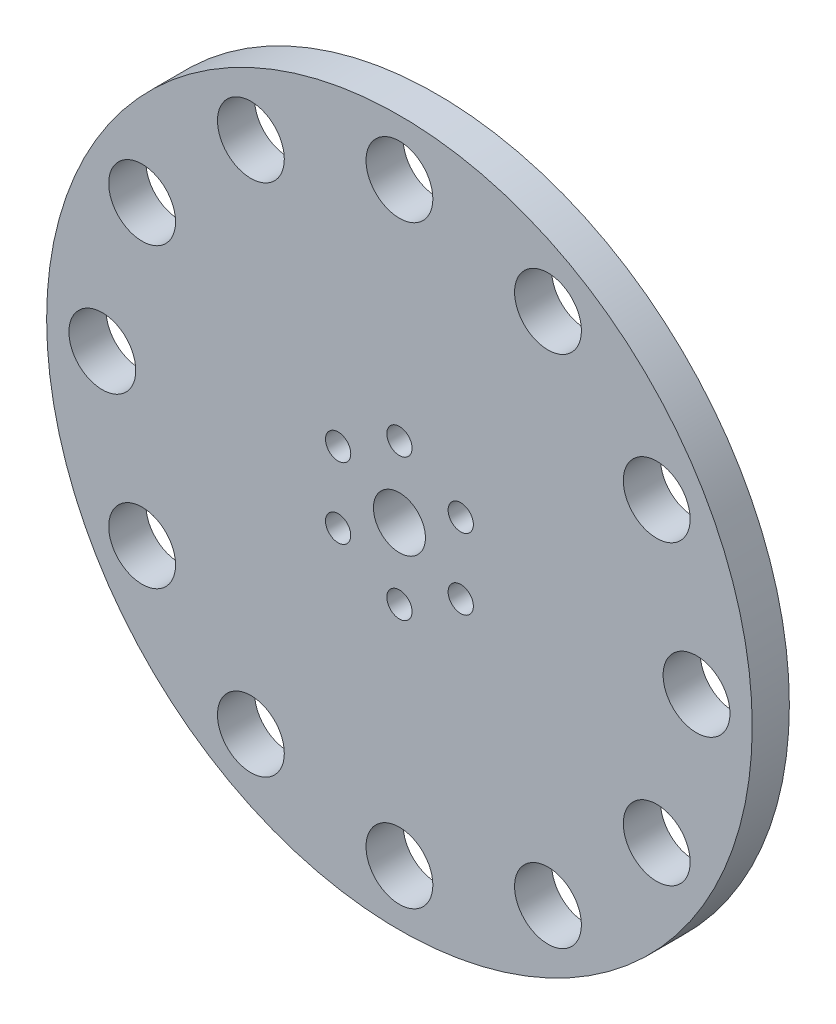
ISO-10303-21;
HEADER;
FILE_DESCRIPTION(('STEP AP214'),'2;1');
FILE_NAME('part.step','',(''),(''),'','','');
FILE_SCHEMA(('AUTOMOTIVE_DESIGN { 1 0 10303 214 1 1 1 1 }'));
ENDSEC;
DATA;
#1=APPLICATION_CONTEXT('core data for automotive mechanical design processes');
#2=APPLICATION_PROTOCOL_DEFINITION('international standard','automotive_design',2000,#1);
#3=PRODUCT_CONTEXT('',#1,'mechanical');
#4=PRODUCT('Part','Part','',(#3));
#5=PRODUCT_RELATED_PRODUCT_CATEGORY('part','',(#4));
#6=PRODUCT_DEFINITION_FORMATION('','',#4);
#7=PRODUCT_DEFINITION_CONTEXT('part definition',#1,'design');
#8=PRODUCT_DEFINITION('design','',#6,#7);
#9=PRODUCT_DEFINITION_SHAPE('','',#8);
#10=(LENGTH_UNIT() NAMED_UNIT(*) SI_UNIT(.MILLI.,.METRE.));
#11=(NAMED_UNIT(*) PLANE_ANGLE_UNIT() SI_UNIT($,.RADIAN.));
#12=(NAMED_UNIT(*) SI_UNIT($,.STERADIAN.) SOLID_ANGLE_UNIT());
#13=UNCERTAINTY_MEASURE_WITH_UNIT(LENGTH_MEASURE(1.E-05),#10,'distance_accuracy_value','');
#14=(GEOMETRIC_REPRESENTATION_CONTEXT(3) GLOBAL_UNCERTAINTY_ASSIGNED_CONTEXT((#13)) GLOBAL_UNIT_ASSIGNED_CONTEXT((#10,
#11,#12)) REPRESENTATION_CONTEXT('',''));
#15=CARTESIAN_POINT('',(0.,0.,0.));
#16=DIRECTION('',(0.,0.,1.));
#17=DIRECTION('',(1.,0.,0.));
#18=AXIS2_PLACEMENT_3D('',#15,#16,#17);
#19=CARTESIAN_POINT('',(0.,0.,5.));
#20=DIRECTION('',(0.,0.,1.));
#21=DIRECTION('',(1.,0.,0.));
#22=AXIS2_PLACEMENT_3D('',#19,#20,#21);
#23=PLANE('',#22);
#24=CARTESIAN_POINT('',(-39.9999999999965,-3.48043475842534E-12,5.));
#25=DIRECTION('',(0.,0.,1.));
#26=DIRECTION('',(1.,0.,0.));
#27=AXIS2_PLACEMENT_3D('',#24,#25,#26);
#28=CIRCLE('',#27,4.5);
#29=CARTESIAN_POINT('',(-35.4999999999965,-3.48043475842534E-12,5.));
#30=VERTEX_POINT('',#29);
#31=EDGE_CURVE('E108',#30,#30,#28,.T.);
#32=ORIENTED_EDGE('',*,*,#31,.F.);
#33=EDGE_LOOP('',(#32));
#34=FACE_BOUND('',#33,.T.);
#35=CARTESIAN_POINT('',(-34.6410161513723,-20.000000000003,5.));
#36=DIRECTION('',(0.,0.,1.));
#37=DIRECTION('',(1.,0.,0.));
#38=AXIS2_PLACEMENT_3D('',#35,#36,#37);
#39=CIRCLE('',#38,4.5);
#40=CARTESIAN_POINT('',(-30.1410161513723,-20.000000000003,5.));
#41=VERTEX_POINT('',#40);
#42=EDGE_CURVE('E115',#41,#41,#39,.T.);
#43=ORIENTED_EDGE('',*,*,#42,.F.);
#44=EDGE_LOOP('',(#43));
#45=FACE_BOUND('',#44,.T.);
#46=CARTESIAN_POINT('',(-19.9999999999935,-34.6410161513793,5.));
#47=DIRECTION('',(0.,0.,1.));
#48=DIRECTION('',(1.,0.,0.));
#49=AXIS2_PLACEMENT_3D('',#46,#47,#48);
#50=CIRCLE('',#49,4.5);
#51=CARTESIAN_POINT('',(-15.4999999999935,-34.6410161513793,5.));
#52=VERTEX_POINT('',#51);
#53=EDGE_CURVE('E121',#52,#52,#50,.T.);
#54=ORIENTED_EDGE('',*,*,#53,.F.);
#55=EDGE_LOOP('',(#54));
#56=FACE_BOUND('',#55,.T.);
#57=CARTESIAN_POINT('',(6.95107234245751E-12,-40.,5.));
#58=DIRECTION('',(0.,0.,1.));
#59=DIRECTION('',(1.,0.,0.));
#60=AXIS2_PLACEMENT_3D('',#57,#58,#59);
#61=CIRCLE('',#60,4.5);
#62=CARTESIAN_POINT('',(4.50000000000695,-40.,5.));
#63=VERTEX_POINT('',#62);
#64=EDGE_CURVE('E127',#63,#63,#61,.T.);
#65=ORIENTED_EDGE('',*,*,#64,.F.);
#66=EDGE_LOOP('',(#65));
#67=FACE_BOUND('',#66,.T.);
#68=CARTESIAN_POINT('',(20.0000000000065,-34.6410161513758,5.));
#69=DIRECTION('',(0.,0.,1.));
#70=DIRECTION('',(1.,0.,0.));
#71=AXIS2_PLACEMENT_3D('',#68,#69,#70);
#72=CIRCLE('',#71,4.5);
#73=CARTESIAN_POINT('',(24.5000000000065,-34.6410161513758,5.));
#74=VERTEX_POINT('',#73);
#75=EDGE_CURVE('E133',#74,#74,#72,.T.);
#76=ORIENTED_EDGE('',*,*,#75,.F.);
#77=EDGE_LOOP('',(#76));
#78=FACE_BOUND('',#77,.T.);
#79=CARTESIAN_POINT('',(34.6410161513828,-19.999999999997,5.));
#80=DIRECTION('',(0.,0.,1.));
#81=DIRECTION('',(1.,0.,0.));
#82=AXIS2_PLACEMENT_3D('',#79,#80,#81);
#83=CIRCLE('',#82,4.50000000000008);
#84=CARTESIAN_POINT('',(39.1410161513828,-19.999999999997,5.));
#85=VERTEX_POINT('',#84);
#86=EDGE_CURVE('E139',#85,#85,#83,.T.);
#87=ORIENTED_EDGE('',*,*,#86,.F.);
#88=EDGE_LOOP('',(#87));
#89=FACE_BOUND('',#88,.T.);
#90=CARTESIAN_POINT('',(40.0000000000035,3.47553617122876E-12,5.));
#91=DIRECTION('',(0.,0.,1.));
#92=DIRECTION('',(1.,0.,0.));
#93=AXIS2_PLACEMENT_3D('',#90,#91,#92);
#94=CIRCLE('',#93,4.5);
#95=CARTESIAN_POINT('',(44.5000000000035,3.47553617122876E-12,5.));
#96=VERTEX_POINT('',#95);
#97=EDGE_CURVE('E145',#96,#96,#94,.T.);
#98=ORIENTED_EDGE('',*,*,#97,.F.);
#99=EDGE_LOOP('',(#98));
#100=FACE_BOUND('',#99,.T.);
#101=CARTESIAN_POINT('',(34.6410161513793,20.000000000003,5.));
#102=DIRECTION('',(0.,0.,1.));
#103=DIRECTION('',(1.,0.,0.));
#104=AXIS2_PLACEMENT_3D('',#101,#102,#103);
#105=CIRCLE('',#104,4.5);
#106=CARTESIAN_POINT('',(39.1410161513793,20.000000000003,5.));
#107=VERTEX_POINT('',#106);
#108=EDGE_CURVE('E151',#107,#107,#105,.T.);
#109=ORIENTED_EDGE('',*,*,#108,.F.);
#110=EDGE_LOOP('',(#109));
#111=FACE_BOUND('',#110,.T.);
#112=CARTESIAN_POINT('',(0.,40.,5.));
#113=DIRECTION('',(0.,0.,1.));
#114=DIRECTION('',(1.,0.,0.));
#115=AXIS2_PLACEMENT_3D('',#112,#113,#114);
#116=CIRCLE('',#115,4.5);
#117=CARTESIAN_POINT('',(4.5,40.,5.));
#118=VERTEX_POINT('',#117);
#119=EDGE_CURVE('E79',#118,#118,#116,.T.);
#120=ORIENTED_EDGE('',*,*,#119,.F.);
#121=EDGE_LOOP('',(#120));
#122=FACE_BOUND('',#121,.T.);
#123=CARTESIAN_POINT('',(-34.6410161513758,19.999999999997,5.));
#124=DIRECTION('',(0.,0.,1.));
#125=DIRECTION('',(1.,0.,0.));
#126=AXIS2_PLACEMENT_3D('',#123,#124,#125);
#127=CIRCLE('',#126,4.5);
#128=CARTESIAN_POINT('',(-30.1410161513758,19.999999999997,5.));
#129=VERTEX_POINT('',#128);
#130=EDGE_CURVE('E73',#129,#129,#127,.T.);
#131=ORIENTED_EDGE('',*,*,#130,.F.);
#132=EDGE_LOOP('',(#131));
#133=FACE_BOUND('',#132,.T.);
#134=CARTESIAN_POINT('',(8.25322209806571,4.76499999999998,5.));
#135=DIRECTION('',(0.,0.,1.));
#136=DIRECTION('',(1.,0.,0.));
#137=AXIS2_PLACEMENT_3D('',#134,#135,#136);
#138=CIRCLE('',#137,1.7);
#139=CARTESIAN_POINT('',(9.95322209806571,4.76499999999998,5.));
#140=VERTEX_POINT('',#139);
#141=EDGE_CURVE('E67',#140,#140,#138,.T.);
#142=ORIENTED_EDGE('',*,*,#141,.F.);
#143=EDGE_LOOP('',(#142));
#144=FACE_BOUND('',#143,.T.);
#145=CARTESIAN_POINT('',(8.25322209806651,-4.76499999999953,5.));
#146=DIRECTION('',(0.,0.,1.));
#147=DIRECTION('',(1.,0.,0.));
#148=AXIS2_PLACEMENT_3D('',#145,#146,#147);
#149=CIRCLE('',#148,1.70000000000068);
#150=CARTESIAN_POINT('',(9.95322209806719,-4.76499999999953,5.));
#151=VERTEX_POINT('',#150);
#152=EDGE_CURVE('E60',#151,#151,#149,.T.);
#153=ORIENTED_EDGE('',*,*,#152,.F.);
#154=EDGE_LOOP('',(#153));
#155=FACE_BOUND('',#154,.T.);
#156=CARTESIAN_POINT('',(1.07993429828824E-12,-9.53,5.));
#157=DIRECTION('',(0.,0.,1.));
#158=DIRECTION('',(1.,0.,0.));
#159=AXIS2_PLACEMENT_3D('',#156,#157,#158);
#160=CIRCLE('',#159,1.7000000000011);
#161=CARTESIAN_POINT('',(1.70000000000218,-9.53,5.));
#162=VERTEX_POINT('',#161);
#163=EDGE_CURVE('E103',#162,#162,#160,.T.);
#164=ORIENTED_EDGE('',*,*,#163,.F.);
#165=EDGE_LOOP('',(#164));
#166=FACE_BOUND('',#165,.T.);
#167=CARTESIAN_POINT('',(-8.25322209806489,-4.76500000000047,5.));
#168=DIRECTION('',(0.,0.,1.));
#169=DIRECTION('',(1.,0.,0.));
#170=AXIS2_PLACEMENT_3D('',#167,#168,#169);
#171=CIRCLE('',#170,1.700000000001);
#172=CARTESIAN_POINT('',(-6.55322209806389,-4.76500000000047,5.));
#173=VERTEX_POINT('',#172);
#174=EDGE_CURVE('E97',#173,#173,#171,.T.);
#175=ORIENTED_EDGE('',*,*,#174,.F.);
#176=EDGE_LOOP('',(#175));
#177=FACE_BOUND('',#176,.T.);
#178=CARTESIAN_POINT('',(-8.25322209806564,4.7650000000001,5.));
#179=DIRECTION('',(0.,0.,1.));
#180=DIRECTION('',(1.,0.,0.));
#181=AXIS2_PLACEMENT_3D('',#178,#179,#180);
#182=CIRCLE('',#181,1.7);
#183=CARTESIAN_POINT('',(-6.55322209806564,4.7650000000001,5.));
#184=VERTEX_POINT('',#183);
#185=EDGE_CURVE('E91',#184,#184,#182,.T.);
#186=ORIENTED_EDGE('',*,*,#185,.F.);
#187=EDGE_LOOP('',(#186));
#188=FACE_BOUND('',#187,.T.);
#189=CARTESIAN_POINT('',(20.0000000000005,34.6410161513793,5.));
#190=DIRECTION('',(0.,0.,1.));
#191=DIRECTION('',(1.,0.,0.));
#192=AXIS2_PLACEMENT_3D('',#189,#190,#191);
#193=CIRCLE('',#192,4.50000000000001);
#194=CARTESIAN_POINT('',(24.5000000000005,34.6410161513793,5.));
#195=VERTEX_POINT('',#194);
#196=EDGE_CURVE('E84',#195,#195,#193,.T.);
#197=ORIENTED_EDGE('',*,*,#196,.F.);
#198=EDGE_LOOP('',(#197));
#199=FACE_BOUND('',#198,.T.);
#200=CARTESIAN_POINT('',(-19.9999999999996,34.6410161513758,5.));
#201=DIRECTION('',(0.,0.,1.));
#202=DIRECTION('',(1.,0.,0.));
#203=AXIS2_PLACEMENT_3D('',#200,#201,#202);
#204=CIRCLE('',#203,4.50000000000001);
#205=CARTESIAN_POINT('',(-15.4999999999995,34.6410161513758,5.));
#206=VERTEX_POINT('',#205);
#207=EDGE_CURVE('E156',#206,#206,#204,.T.);
#208=ORIENTED_EDGE('',*,*,#207,.F.);
#209=EDGE_LOOP('',(#208));
#210=FACE_BOUND('',#209,.T.);
#211=CARTESIAN_POINT('',(0.,9.53,5.));
#212=DIRECTION('',(0.,0.,1.));
#213=DIRECTION('',(1.,0.,0.));
#214=AXIS2_PLACEMENT_3D('',#211,#212,#213);
#215=CIRCLE('',#214,1.7);
#216=CARTESIAN_POINT('',(1.7,9.53,5.));
#217=VERTEX_POINT('',#216);
#218=EDGE_CURVE('E54',#217,#217,#215,.T.);
#219=ORIENTED_EDGE('',*,*,#218,.F.);
#220=EDGE_LOOP('',(#219));
#221=FACE_BOUND('',#220,.T.);
#222=CARTESIAN_POINT('',(0.,0.,5.));
#223=DIRECTION('',(0.,0.,1.));
#224=DIRECTION('',(1.,0.,0.));
#225=AXIS2_PLACEMENT_3D('',#222,#223,#224);
#226=CIRCLE('',#225,47.5);
#227=CARTESIAN_POINT('',(47.5,0.,5.));
#228=VERTEX_POINT('',#227);
#229=EDGE_CURVE('E10',#228,#228,#226,.T.);
#230=ORIENTED_EDGE('',*,*,#229,.T.);
#231=EDGE_LOOP('',(#230));
#232=FACE_BOUND('',#231,.T.);
#233=CARTESIAN_POINT('',(0.,0.,5.));
#234=DIRECTION('',(0.,0.,1.));
#235=DIRECTION('',(1.,0.,0.));
#236=AXIS2_PLACEMENT_3D('',#233,#234,#235);
#237=CIRCLE('',#236,3.5);
#238=CARTESIAN_POINT('',(3.5,0.,5.));
#239=VERTEX_POINT('',#238);
#240=EDGE_CURVE('E46',#239,#239,#237,.T.);
#241=ORIENTED_EDGE('',*,*,#240,.F.);
#242=EDGE_LOOP('',(#241));
#243=FACE_BOUND('',#242,.T.);
#244=ADVANCED_FACE('F35',(#34,#45,#56,#67,#78,#89,#100,#111,#122,#133,#144,#155,#166,#177,#188,
#199,#210,#221,#232,#243),#23,.T.);
#245=CARTESIAN_POINT('',(0.,0.,0.));
#246=DIRECTION('',(0.,0.,1.));
#247=DIRECTION('',(1.,0.,0.));
#248=AXIS2_PLACEMENT_3D('',#245,#246,#247);
#249=PLANE('',#248);
#250=CARTESIAN_POINT('',(-39.9999999999965,-3.48043475842534E-12,0.));
#251=DIRECTION('',(0.,0.,1.));
#252=DIRECTION('',(1.,0.,0.));
#253=AXIS2_PLACEMENT_3D('',#250,#251,#252);
#254=CIRCLE('',#253,4.5);
#255=CARTESIAN_POINT('',(-35.4999999999965,-3.48043475842534E-12,0.));
#256=VERTEX_POINT('',#255);
#257=EDGE_CURVE('E111',#256,#256,#254,.T.);
#258=ORIENTED_EDGE('',*,*,#257,.T.);
#259=EDGE_LOOP('',(#258));
#260=FACE_BOUND('',#259,.T.);
#261=CARTESIAN_POINT('',(-34.6410161513723,-20.000000000003,0.));
#262=DIRECTION('',(0.,0.,1.));
#263=DIRECTION('',(1.,0.,0.));
#264=AXIS2_PLACEMENT_3D('',#261,#262,#263);
#265=CIRCLE('',#264,4.5);
#266=CARTESIAN_POINT('',(-30.1410161513723,-20.000000000003,0.));
#267=VERTEX_POINT('',#266);
#268=EDGE_CURVE('E118',#267,#267,#265,.T.);
#269=ORIENTED_EDGE('',*,*,#268,.T.);
#270=EDGE_LOOP('',(#269));
#271=FACE_BOUND('',#270,.T.);
#272=CARTESIAN_POINT('',(-19.9999999999935,-34.6410161513793,0.));
#273=DIRECTION('',(0.,0.,1.));
#274=DIRECTION('',(1.,0.,0.));
#275=AXIS2_PLACEMENT_3D('',#272,#273,#274);
#276=CIRCLE('',#275,4.5);
#277=CARTESIAN_POINT('',(-15.4999999999935,-34.6410161513793,0.));
#278=VERTEX_POINT('',#277);
#279=EDGE_CURVE('E124',#278,#278,#276,.T.);
#280=ORIENTED_EDGE('',*,*,#279,.T.);
#281=EDGE_LOOP('',(#280));
#282=FACE_BOUND('',#281,.T.);
#283=CARTESIAN_POINT('',(6.95107234245751E-12,-40.,0.));
#284=DIRECTION('',(0.,0.,1.));
#285=DIRECTION('',(1.,0.,0.));
#286=AXIS2_PLACEMENT_3D('',#283,#284,#285);
#287=CIRCLE('',#286,4.5);
#288=CARTESIAN_POINT('',(4.50000000000695,-40.,0.));
#289=VERTEX_POINT('',#288);
#290=EDGE_CURVE('E130',#289,#289,#287,.T.);
#291=ORIENTED_EDGE('',*,*,#290,.T.);
#292=EDGE_LOOP('',(#291));
#293=FACE_BOUND('',#292,.T.);
#294=CARTESIAN_POINT('',(20.0000000000065,-34.6410161513758,0.));
#295=DIRECTION('',(0.,0.,1.));
#296=DIRECTION('',(1.,0.,0.));
#297=AXIS2_PLACEMENT_3D('',#294,#295,#296);
#298=CIRCLE('',#297,4.5);
#299=CARTESIAN_POINT('',(24.5000000000065,-34.6410161513758,0.));
#300=VERTEX_POINT('',#299);
#301=EDGE_CURVE('E136',#300,#300,#298,.T.);
#302=ORIENTED_EDGE('',*,*,#301,.T.);
#303=EDGE_LOOP('',(#302));
#304=FACE_BOUND('',#303,.T.);
#305=CARTESIAN_POINT('',(34.6410161513828,-19.999999999997,0.));
#306=DIRECTION('',(0.,0.,1.));
#307=DIRECTION('',(1.,0.,0.));
#308=AXIS2_PLACEMENT_3D('',#305,#306,#307);
#309=CIRCLE('',#308,4.50000000000008);
#310=CARTESIAN_POINT('',(39.1410161513828,-19.999999999997,0.));
#311=VERTEX_POINT('',#310);
#312=EDGE_CURVE('E142',#311,#311,#309,.T.);
#313=ORIENTED_EDGE('',*,*,#312,.T.);
#314=EDGE_LOOP('',(#313));
#315=FACE_BOUND('',#314,.T.);
#316=CARTESIAN_POINT('',(40.0000000000035,3.47553617122876E-12,0.));
#317=DIRECTION('',(0.,0.,1.));
#318=DIRECTION('',(1.,0.,0.));
#319=AXIS2_PLACEMENT_3D('',#316,#317,#318);
#320=CIRCLE('',#319,4.5);
#321=CARTESIAN_POINT('',(44.5000000000035,3.47553617122876E-12,0.));
#322=VERTEX_POINT('',#321);
#323=EDGE_CURVE('E148',#322,#322,#320,.T.);
#324=ORIENTED_EDGE('',*,*,#323,.T.);
#325=EDGE_LOOP('',(#324));
#326=FACE_BOUND('',#325,.T.);
#327=CARTESIAN_POINT('',(34.6410161513793,20.000000000003,0.));
#328=DIRECTION('',(0.,0.,1.));
#329=DIRECTION('',(1.,0.,0.));
#330=AXIS2_PLACEMENT_3D('',#327,#328,#329);
#331=CIRCLE('',#330,4.5);
#332=CARTESIAN_POINT('',(39.1410161513793,20.000000000003,0.));
#333=VERTEX_POINT('',#332);
#334=EDGE_CURVE('E88',#333,#333,#331,.T.);
#335=ORIENTED_EDGE('',*,*,#334,.T.);
#336=EDGE_LOOP('',(#335));
#337=FACE_BOUND('',#336,.T.);
#338=CARTESIAN_POINT('',(0.,40.,0.));
#339=DIRECTION('',(0.,0.,1.));
#340=DIRECTION('',(1.,0.,0.));
#341=AXIS2_PLACEMENT_3D('',#338,#339,#340);
#342=CIRCLE('',#341,4.5);
#343=CARTESIAN_POINT('',(4.5,40.,0.));
#344=VERTEX_POINT('',#343);
#345=EDGE_CURVE('E57',#344,#344,#342,.T.);
#346=ORIENTED_EDGE('',*,*,#345,.T.);
#347=EDGE_LOOP('',(#346));
#348=FACE_BOUND('',#347,.T.);
#349=CARTESIAN_POINT('',(-34.6410161513758,19.999999999997,0.));
#350=DIRECTION('',(0.,0.,1.));
#351=DIRECTION('',(1.,0.,0.));
#352=AXIS2_PLACEMENT_3D('',#349,#350,#351);
#353=CIRCLE('',#352,4.5);
#354=CARTESIAN_POINT('',(-30.1410161513758,19.999999999997,0.));
#355=VERTEX_POINT('',#354);
#356=EDGE_CURVE('E76',#355,#355,#353,.T.);
#357=ORIENTED_EDGE('',*,*,#356,.T.);
#358=EDGE_LOOP('',(#357));
#359=FACE_BOUND('',#358,.T.);
#360=CARTESIAN_POINT('',(8.25322209806571,4.76499999999998,0.));
#361=DIRECTION('',(0.,0.,1.));
#362=DIRECTION('',(1.,0.,0.));
#363=AXIS2_PLACEMENT_3D('',#360,#361,#362);
#364=CIRCLE('',#363,1.7);
#365=CARTESIAN_POINT('',(9.95322209806571,4.76499999999998,0.));
#366=VERTEX_POINT('',#365);
#367=EDGE_CURVE('E70',#366,#366,#364,.T.);
#368=ORIENTED_EDGE('',*,*,#367,.T.);
#369=EDGE_LOOP('',(#368));
#370=FACE_BOUND('',#369,.T.);
#371=CARTESIAN_POINT('',(8.25322209806651,-4.76499999999953,0.));
#372=DIRECTION('',(0.,0.,1.));
#373=DIRECTION('',(1.,0.,0.));
#374=AXIS2_PLACEMENT_3D('',#371,#372,#373);
#375=CIRCLE('',#374,1.70000000000068);
#376=CARTESIAN_POINT('',(9.95322209806719,-4.76499999999953,0.));
#377=VERTEX_POINT('',#376);
#378=EDGE_CURVE('E63',#377,#377,#375,.T.);
#379=ORIENTED_EDGE('',*,*,#378,.T.);
#380=EDGE_LOOP('',(#379));
#381=FACE_BOUND('',#380,.T.);
#382=CARTESIAN_POINT('',(1.07993429828824E-12,-9.53,0.));
#383=DIRECTION('',(0.,0.,1.));
#384=DIRECTION('',(1.,0.,0.));
#385=AXIS2_PLACEMENT_3D('',#382,#383,#384);
#386=CIRCLE('',#385,1.7000000000011);
#387=CARTESIAN_POINT('',(1.70000000000218,-9.53,0.));
#388=VERTEX_POINT('',#387);
#389=EDGE_CURVE('E64',#388,#388,#386,.T.);
#390=ORIENTED_EDGE('',*,*,#389,.T.);
#391=EDGE_LOOP('',(#390));
#392=FACE_BOUND('',#391,.T.);
#393=CARTESIAN_POINT('',(-8.25322209806489,-4.76500000000047,0.));
#394=DIRECTION('',(0.,0.,1.));
#395=DIRECTION('',(1.,0.,0.));
#396=AXIS2_PLACEMENT_3D('',#393,#394,#395);
#397=CIRCLE('',#396,1.700000000001);
#398=CARTESIAN_POINT('',(-6.55322209806389,-4.76500000000047,0.));
#399=VERTEX_POINT('',#398);
#400=EDGE_CURVE('E100',#399,#399,#397,.T.);
#401=ORIENTED_EDGE('',*,*,#400,.T.);
#402=EDGE_LOOP('',(#401));
#403=FACE_BOUND('',#402,.T.);
#404=CARTESIAN_POINT('',(-8.25322209806564,4.7650000000001,0.));
#405=DIRECTION('',(0.,0.,1.));
#406=DIRECTION('',(1.,0.,0.));
#407=AXIS2_PLACEMENT_3D('',#404,#405,#406);
#408=CIRCLE('',#407,1.7);
#409=CARTESIAN_POINT('',(-6.55322209806564,4.7650000000001,0.));
#410=VERTEX_POINT('',#409);
#411=EDGE_CURVE('E94',#410,#410,#408,.T.);
#412=ORIENTED_EDGE('',*,*,#411,.T.);
#413=EDGE_LOOP('',(#412));
#414=FACE_BOUND('',#413,.T.);
#415=CARTESIAN_POINT('',(20.0000000000005,34.6410161513793,0.));
#416=DIRECTION('',(0.,0.,1.));
#417=DIRECTION('',(1.,0.,0.));
#418=AXIS2_PLACEMENT_3D('',#415,#416,#417);
#419=CIRCLE('',#418,4.50000000000001);
#420=CARTESIAN_POINT('',(24.5000000000005,34.6410161513793,0.));
#421=VERTEX_POINT('',#420);
#422=EDGE_CURVE('E87',#421,#421,#419,.T.);
#423=ORIENTED_EDGE('',*,*,#422,.T.);
#424=EDGE_LOOP('',(#423));
#425=FACE_BOUND('',#424,.T.);
#426=CARTESIAN_POINT('',(-19.9999999999996,34.6410161513758,0.));
#427=DIRECTION('',(0.,0.,1.));
#428=DIRECTION('',(1.,0.,0.));
#429=AXIS2_PLACEMENT_3D('',#426,#427,#428);
#430=CIRCLE('',#429,4.50000000000001);
#431=CARTESIAN_POINT('',(-15.4999999999995,34.6410161513758,0.));
#432=VERTEX_POINT('',#431);
#433=EDGE_CURVE('E112',#432,#432,#430,.T.);
#434=ORIENTED_EDGE('',*,*,#433,.T.);
#435=EDGE_LOOP('',(#434));
#436=FACE_BOUND('',#435,.T.);
#437=CARTESIAN_POINT('',(0.,9.53,0.));
#438=DIRECTION('',(0.,0.,1.));
#439=DIRECTION('',(1.,0.,0.));
#440=AXIS2_PLACEMENT_3D('',#437,#438,#439);
#441=CIRCLE('',#440,1.7);
#442=CARTESIAN_POINT('',(1.7,9.53,0.));
#443=VERTEX_POINT('',#442);
#444=EDGE_CURVE('E51',#443,#443,#441,.T.);
#445=ORIENTED_EDGE('',*,*,#444,.T.);
#446=EDGE_LOOP('',(#445));
#447=FACE_BOUND('',#446,.T.);
#448=CARTESIAN_POINT('',(0.,0.,0.));
#449=DIRECTION('',(0.,0.,1.));
#450=DIRECTION('',(1.,0.,0.));
#451=AXIS2_PLACEMENT_3D('',#448,#449,#450);
#452=CIRCLE('',#451,47.5);
#453=CARTESIAN_POINT('',(47.5,0.,0.));
#454=VERTEX_POINT('',#453);
#455=EDGE_CURVE('E39',#454,#454,#452,.T.);
#456=ORIENTED_EDGE('',*,*,#455,.F.);
#457=EDGE_LOOP('',(#456));
#458=FACE_BOUND('',#457,.T.);
#459=CARTESIAN_POINT('',(0.,0.,0.));
#460=DIRECTION('',(0.,0.,1.));
#461=DIRECTION('',(1.,0.,0.));
#462=AXIS2_PLACEMENT_3D('',#459,#460,#461);
#463=CIRCLE('',#462,3.5);
#464=CARTESIAN_POINT('',(3.5,0.,0.));
#465=VERTEX_POINT('',#464);
#466=EDGE_CURVE('E48',#465,#465,#463,.T.);
#467=ORIENTED_EDGE('',*,*,#466,.T.);
#468=EDGE_LOOP('',(#467));
#469=FACE_BOUND('',#468,.T.);
#470=ADVANCED_FACE('F162',(#260,#271,#282,#293,#304,#315,#326,#337,#348,#359,#370,#381,#392,
#403,#414,#425,#436,#447,#458,#469),#249,.F.);
#471=CARTESIAN_POINT('',(0.,0.,5.));
#472=DIRECTION('',(0.,0.,-1.));
#473=DIRECTION('',(-1.,0.,0.));
#474=AXIS2_PLACEMENT_3D('',#471,#472,#473);
#475=CYLINDRICAL_SURFACE('',#474,47.5);
#476=ORIENTED_EDGE('',*,*,#229,.F.);
#477=EDGE_LOOP('',(#476));
#478=FACE_BOUND('',#477,.T.);
#479=ORIENTED_EDGE('',*,*,#455,.T.);
#480=EDGE_LOOP('',(#479));
#481=FACE_BOUND('',#480,.T.);
#482=ADVANCED_FACE('F37',(#478,#481),#475,.T.);
#483=CARTESIAN_POINT('',(0.,0.,5.));
#484=DIRECTION('',(0.,0.,-1.));
#485=DIRECTION('',(-1.,0.,0.));
#486=AXIS2_PLACEMENT_3D('',#483,#484,#485);
#487=CYLINDRICAL_SURFACE('',#486,3.5);
#488=ORIENTED_EDGE('',*,*,#240,.T.);
#489=EDGE_LOOP('',(#488));
#490=FACE_BOUND('',#489,.T.);
#491=ORIENTED_EDGE('',*,*,#466,.F.);
#492=EDGE_LOOP('',(#491));
#493=FACE_BOUND('',#492,.T.);
#494=ADVANCED_FACE('F181',(#490,#493),#487,.F.);
#495=CARTESIAN_POINT('',(0.,9.53,0.));
#496=DIRECTION('',(0.,0.,1.));
#497=DIRECTION('',(1.,0.,0.));
#498=AXIS2_PLACEMENT_3D('',#495,#496,#497);
#499=CYLINDRICAL_SURFACE('',#498,1.7);
#500=ORIENTED_EDGE('',*,*,#444,.F.);
#501=EDGE_LOOP('',(#500));
#502=FACE_BOUND('',#501,.T.);
#503=ORIENTED_EDGE('',*,*,#218,.T.);
#504=EDGE_LOOP('',(#503));
#505=FACE_BOUND('',#504,.T.);
#506=ADVANCED_FACE('F169',(#502,#505),#499,.F.);
#507=CARTESIAN_POINT('',(-19.9999999999996,34.6410161513758,0.));
#508=DIRECTION('',(0.,0.,1.));
#509=DIRECTION('',(1.,0.,0.));
#510=AXIS2_PLACEMENT_3D('',#507,#508,#509);
#511=CYLINDRICAL_SURFACE('',#510,4.50000000000001);
#512=ORIENTED_EDGE('',*,*,#433,.F.);
#513=EDGE_LOOP('',(#512));
#514=FACE_BOUND('',#513,.T.);
#515=ORIENTED_EDGE('',*,*,#207,.T.);
#516=EDGE_LOOP('',(#515));
#517=FACE_BOUND('',#516,.T.);
#518=ADVANCED_FACE('F165',(#514,#517),#511,.F.);
#519=CARTESIAN_POINT('',(20.0000000000005,34.6410161513793,0.));
#520=DIRECTION('',(0.,0.,1.));
#521=DIRECTION('',(1.,0.,0.));
#522=AXIS2_PLACEMENT_3D('',#519,#520,#521);
#523=CYLINDRICAL_SURFACE('',#522,4.50000000000001);
#524=ORIENTED_EDGE('',*,*,#422,.F.);
#525=EDGE_LOOP('',(#524));
#526=FACE_BOUND('',#525,.T.);
#527=ORIENTED_EDGE('',*,*,#196,.T.);
#528=EDGE_LOOP('',(#527));
#529=FACE_BOUND('',#528,.T.);
#530=ADVANCED_FACE('F168',(#526,#529),#523,.F.);
#531=CARTESIAN_POINT('',(-8.25322209806564,4.7650000000001,0.));
#532=DIRECTION('',(0.,0.,1.));
#533=DIRECTION('',(1.,0.,0.));
#534=AXIS2_PLACEMENT_3D('',#531,#532,#533);
#535=CYLINDRICAL_SURFACE('',#534,1.7);
#536=ORIENTED_EDGE('',*,*,#411,.F.);
#537=EDGE_LOOP('',(#536));
#538=FACE_BOUND('',#537,.T.);
#539=ORIENTED_EDGE('',*,*,#185,.T.);
#540=EDGE_LOOP('',(#539));
#541=FACE_BOUND('',#540,.T.);
#542=ADVANCED_FACE('F218',(#538,#541),#535,.F.);
#543=CARTESIAN_POINT('',(-8.25322209806489,-4.76500000000047,0.));
#544=DIRECTION('',(0.,0.,1.));
#545=DIRECTION('',(1.,0.,0.));
#546=AXIS2_PLACEMENT_3D('',#543,#544,#545);
#547=CYLINDRICAL_SURFACE('',#546,1.700000000001);
#548=ORIENTED_EDGE('',*,*,#400,.F.);
#549=EDGE_LOOP('',(#548));
#550=FACE_BOUND('',#549,.T.);
#551=ORIENTED_EDGE('',*,*,#174,.T.);
#552=EDGE_LOOP('',(#551));
#553=FACE_BOUND('',#552,.T.);
#554=ADVANCED_FACE('F222',(#550,#553),#547,.F.);
#555=CARTESIAN_POINT('',(1.07993429828824E-12,-9.53,0.));
#556=DIRECTION('',(0.,0.,1.));
#557=DIRECTION('',(1.,0.,0.));
#558=AXIS2_PLACEMENT_3D('',#555,#556,#557);
#559=CYLINDRICAL_SURFACE('',#558,1.7000000000011);
#560=ORIENTED_EDGE('',*,*,#389,.F.);
#561=EDGE_LOOP('',(#560));
#562=FACE_BOUND('',#561,.T.);
#563=ORIENTED_EDGE('',*,*,#163,.T.);
#564=EDGE_LOOP('',(#563));
#565=FACE_BOUND('',#564,.T.);
#566=ADVANCED_FACE('F202',(#562,#565),#559,.F.);
#567=CARTESIAN_POINT('',(8.25322209806651,-4.76499999999953,0.));
#568=DIRECTION('',(0.,0.,1.));
#569=DIRECTION('',(1.,0.,0.));
#570=AXIS2_PLACEMENT_3D('',#567,#568,#569);
#571=CYLINDRICAL_SURFACE('',#570,1.70000000000068);
#572=ORIENTED_EDGE('',*,*,#378,.F.);
#573=EDGE_LOOP('',(#572));
#574=FACE_BOUND('',#573,.T.);
#575=ORIENTED_EDGE('',*,*,#152,.T.);
#576=EDGE_LOOP('',(#575));
#577=FACE_BOUND('',#576,.T.);
#578=ADVANCED_FACE('F198',(#574,#577),#571,.F.);
#579=CARTESIAN_POINT('',(8.25322209806571,4.76499999999998,0.));
#580=DIRECTION('',(0.,0.,1.));
#581=DIRECTION('',(1.,0.,0.));
#582=AXIS2_PLACEMENT_3D('',#579,#580,#581);
#583=CYLINDRICAL_SURFACE('',#582,1.7);
#584=ORIENTED_EDGE('',*,*,#367,.F.);
#585=EDGE_LOOP('',(#584));
#586=FACE_BOUND('',#585,.T.);
#587=ORIENTED_EDGE('',*,*,#141,.T.);
#588=EDGE_LOOP('',(#587));
#589=FACE_BOUND('',#588,.T.);
#590=ADVANCED_FACE('F201',(#586,#589),#583,.F.);
#591=CARTESIAN_POINT('',(-34.6410161513758,19.999999999997,0.));
#592=DIRECTION('',(0.,0.,1.));
#593=DIRECTION('',(1.,0.,0.));
#594=AXIS2_PLACEMENT_3D('',#591,#592,#593);
#595=CYLINDRICAL_SURFACE('',#594,4.5);
#596=ORIENTED_EDGE('',*,*,#356,.F.);
#597=EDGE_LOOP('',(#596));
#598=FACE_BOUND('',#597,.T.);
#599=ORIENTED_EDGE('',*,*,#130,.T.);
#600=EDGE_LOOP('',(#599));
#601=FACE_BOUND('',#600,.T.);
#602=ADVANCED_FACE('F206',(#598,#601),#595,.F.);
#603=CARTESIAN_POINT('',(0.,40.,0.));
#604=DIRECTION('',(0.,0.,1.));
#605=DIRECTION('',(1.,0.,0.));
#606=AXIS2_PLACEMENT_3D('',#603,#604,#605);
#607=CYLINDRICAL_SURFACE('',#606,4.5);
#608=ORIENTED_EDGE('',*,*,#345,.F.);
#609=EDGE_LOOP('',(#608));
#610=FACE_BOUND('',#609,.T.);
#611=ORIENTED_EDGE('',*,*,#119,.T.);
#612=EDGE_LOOP('',(#611));
#613=FACE_BOUND('',#612,.T.);
#614=ADVANCED_FACE('F210',(#610,#613),#607,.F.);
#615=CARTESIAN_POINT('',(34.6410161513793,20.000000000003,0.));
#616=DIRECTION('',(0.,0.,1.));
#617=DIRECTION('',(1.,0.,0.));
#618=AXIS2_PLACEMENT_3D('',#615,#616,#617);
#619=CYLINDRICAL_SURFACE('',#618,4.5);
#620=ORIENTED_EDGE('',*,*,#334,.F.);
#621=EDGE_LOOP('',(#620));
#622=FACE_BOUND('',#621,.T.);
#623=ORIENTED_EDGE('',*,*,#108,.T.);
#624=EDGE_LOOP('',(#623));
#625=FACE_BOUND('',#624,.T.);
#626=ADVANCED_FACE('F214',(#622,#625),#619,.F.);
#627=CARTESIAN_POINT('',(40.0000000000035,3.47553617122876E-12,0.));
#628=DIRECTION('',(0.,0.,1.));
#629=DIRECTION('',(1.,0.,0.));
#630=AXIS2_PLACEMENT_3D('',#627,#628,#629);
#631=CYLINDRICAL_SURFACE('',#630,4.5);
#632=ORIENTED_EDGE('',*,*,#323,.F.);
#633=EDGE_LOOP('',(#632));
#634=FACE_BOUND('',#633,.T.);
#635=ORIENTED_EDGE('',*,*,#97,.T.);
#636=EDGE_LOOP('',(#635));
#637=FACE_BOUND('',#636,.T.);
#638=ADVANCED_FACE('F253',(#634,#637),#631,.F.);
#639=CARTESIAN_POINT('',(34.6410161513828,-19.999999999997,0.));
#640=DIRECTION('',(0.,0.,1.));
#641=DIRECTION('',(1.,0.,0.));
#642=AXIS2_PLACEMENT_3D('',#639,#640,#641);
#643=CYLINDRICAL_SURFACE('',#642,4.50000000000008);
#644=ORIENTED_EDGE('',*,*,#312,.F.);
#645=EDGE_LOOP('',(#644));
#646=FACE_BOUND('',#645,.T.);
#647=ORIENTED_EDGE('',*,*,#86,.T.);
#648=EDGE_LOOP('',(#647));
#649=FACE_BOUND('',#648,.T.);
#650=ADVANCED_FACE('F249',(#646,#649),#643,.F.);
#651=CARTESIAN_POINT('',(20.0000000000065,-34.6410161513758,0.));
#652=DIRECTION('',(0.,0.,1.));
#653=DIRECTION('',(1.,0.,0.));
#654=AXIS2_PLACEMENT_3D('',#651,#652,#653);
#655=CYLINDRICAL_SURFACE('',#654,4.5);
#656=ORIENTED_EDGE('',*,*,#301,.F.);
#657=EDGE_LOOP('',(#656));
#658=FACE_BOUND('',#657,.T.);
#659=ORIENTED_EDGE('',*,*,#75,.T.);
#660=EDGE_LOOP('',(#659));
#661=FACE_BOUND('',#660,.T.);
#662=ADVANCED_FACE('F245',(#658,#661),#655,.F.);
#663=CARTESIAN_POINT('',(6.95107234245751E-12,-40.,0.));
#664=DIRECTION('',(0.,0.,1.));
#665=DIRECTION('',(1.,0.,0.));
#666=AXIS2_PLACEMENT_3D('',#663,#664,#665);
#667=CYLINDRICAL_SURFACE('',#666,4.5);
#668=ORIENTED_EDGE('',*,*,#290,.F.);
#669=EDGE_LOOP('',(#668));
#670=FACE_BOUND('',#669,.T.);
#671=ORIENTED_EDGE('',*,*,#64,.T.);
#672=EDGE_LOOP('',(#671));
#673=FACE_BOUND('',#672,.T.);
#674=ADVANCED_FACE('F241',(#670,#673),#667,.F.);
#675=CARTESIAN_POINT('',(-19.9999999999935,-34.6410161513793,0.));
#676=DIRECTION('',(0.,0.,1.));
#677=DIRECTION('',(1.,0.,0.));
#678=AXIS2_PLACEMENT_3D('',#675,#676,#677);
#679=CYLINDRICAL_SURFACE('',#678,4.5);
#680=ORIENTED_EDGE('',*,*,#279,.F.);
#681=EDGE_LOOP('',(#680));
#682=FACE_BOUND('',#681,.T.);
#683=ORIENTED_EDGE('',*,*,#53,.T.);
#684=EDGE_LOOP('',(#683));
#685=FACE_BOUND('',#684,.T.);
#686=ADVANCED_FACE('F237',(#682,#685),#679,.F.);
#687=CARTESIAN_POINT('',(-34.6410161513723,-20.000000000003,0.));
#688=DIRECTION('',(0.,0.,1.));
#689=DIRECTION('',(1.,0.,0.));
#690=AXIS2_PLACEMENT_3D('',#687,#688,#689);
#691=CYLINDRICAL_SURFACE('',#690,4.5);
#692=ORIENTED_EDGE('',*,*,#268,.F.);
#693=EDGE_LOOP('',(#692));
#694=FACE_BOUND('',#693,.T.);
#695=ORIENTED_EDGE('',*,*,#42,.T.);
#696=EDGE_LOOP('',(#695));
#697=FACE_BOUND('',#696,.T.);
#698=ADVANCED_FACE('F233',(#694,#697),#691,.F.);
#699=CARTESIAN_POINT('',(-39.9999999999965,-3.48043475842534E-12,0.));
#700=DIRECTION('',(0.,0.,1.));
#701=DIRECTION('',(1.,0.,0.));
#702=AXIS2_PLACEMENT_3D('',#699,#700,#701);
#703=CYLINDRICAL_SURFACE('',#702,4.5);
#704=ORIENTED_EDGE('',*,*,#257,.F.);
#705=EDGE_LOOP('',(#704));
#706=FACE_BOUND('',#705,.T.);
#707=ORIENTED_EDGE('',*,*,#31,.T.);
#708=EDGE_LOOP('',(#707));
#709=FACE_BOUND('',#708,.T.);
#710=ADVANCED_FACE('F230',(#706,#709),#703,.F.);
#711=CLOSED_SHELL('',(#244,#470,#482,#494,#506,#518,#530,#542,#554,#566,#578,#590,#602,#614,
#626,#638,#650,#662,#674,#686,#698,#710));
#712=MANIFOLD_SOLID_BREP('B2',#711);
#713=ADVANCED_BREP_SHAPE_REPRESENTATION('',(#18,#712),#14);
#714=SHAPE_DEFINITION_REPRESENTATION(#9,#713);
ENDSEC;
END-ISO-10303-21;
